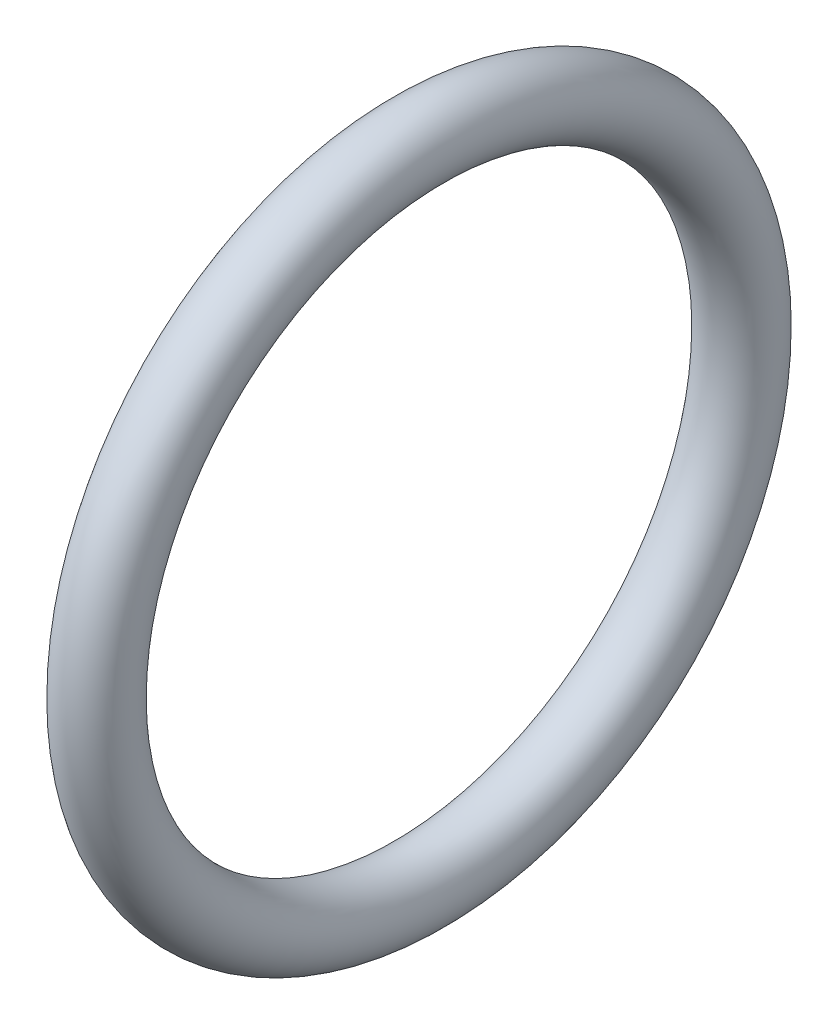
ISO-10303-21;
HEADER;
FILE_DESCRIPTION(('STEP AP214'),'2;1');
FILE_NAME('part.step','',(''),(''),'','','');
FILE_SCHEMA(('AUTOMOTIVE_DESIGN { 1 0 10303 214 1 1 1 1 }'));
ENDSEC;
DATA;
#1=APPLICATION_CONTEXT('core data for automotive mechanical design processes');
#2=APPLICATION_PROTOCOL_DEFINITION('international standard','automotive_design',2000,#1);
#3=PRODUCT_CONTEXT('',#1,'mechanical');
#4=PRODUCT('Part','Part','',(#3));
#5=PRODUCT_RELATED_PRODUCT_CATEGORY('part','',(#4));
#6=PRODUCT_DEFINITION_FORMATION('','',#4);
#7=PRODUCT_DEFINITION_CONTEXT('part definition',#1,'design');
#8=PRODUCT_DEFINITION('design','',#6,#7);
#9=PRODUCT_DEFINITION_SHAPE('','',#8);
#10=(LENGTH_UNIT() NAMED_UNIT(*) SI_UNIT(.MILLI.,.METRE.));
#11=(NAMED_UNIT(*) PLANE_ANGLE_UNIT() SI_UNIT($,.RADIAN.));
#12=(NAMED_UNIT(*) SI_UNIT($,.STERADIAN.) SOLID_ANGLE_UNIT());
#13=UNCERTAINTY_MEASURE_WITH_UNIT(LENGTH_MEASURE(1.E-05),#10,'distance_accuracy_value','');
#14=(GEOMETRIC_REPRESENTATION_CONTEXT(3) GLOBAL_UNCERTAINTY_ASSIGNED_CONTEXT((#13)) GLOBAL_UNIT_ASSIGNED_CONTEXT((#10,
#11,#12)) REPRESENTATION_CONTEXT('',''));
#15=CARTESIAN_POINT('',(0.,0.,0.));
#16=DIRECTION('',(0.,0.,1.));
#17=DIRECTION('',(1.,0.,0.));
#18=AXIS2_PLACEMENT_3D('',#15,#16,#17);
#19=CARTESIAN_POINT('',(0.,0.,0.));
#20=DIRECTION('',(-1.,0.,0.));
#21=DIRECTION('',(0.,0.,1.));
#22=AXIS2_PLACEMENT_3D('',#19,#20,#21);
#23=TOROIDAL_SURFACE('',#22,13.75,1.5);
#24=CARTESIAN_POINT('',(0.,0.,15.25));
#25=VERTEX_POINT('',#24);
#26=VERTEX_LOOP('',#25);
#27=FACE_BOUND('',#26,.T.);
#28=ADVANCED_FACE('F35',(#27),#23,.T.);
#29=CLOSED_SHELL('',(#28));
#30=MANIFOLD_SOLID_BREP('B2',#29);
#31=ADVANCED_BREP_SHAPE_REPRESENTATION('',(#18,#30),#14);
#32=SHAPE_DEFINITION_REPRESENTATION(#9,#31);
ENDSEC;
END-ISO-10303-21;
